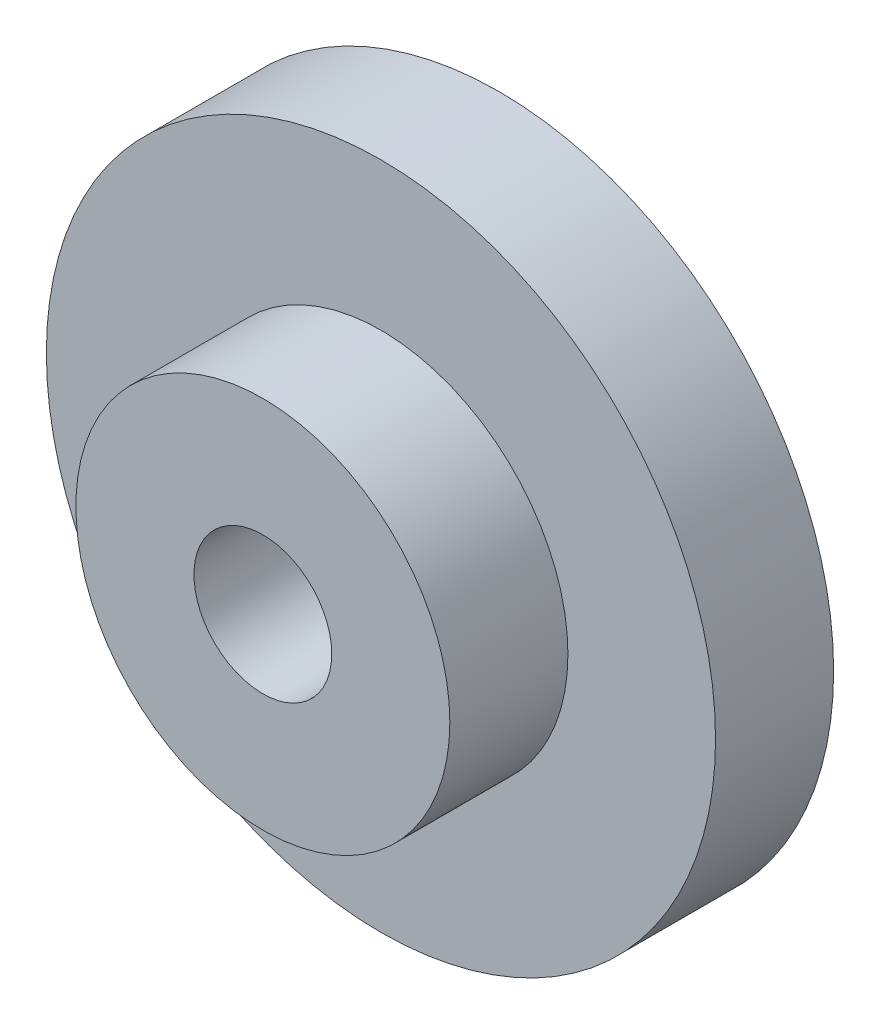
ISO-10303-21;
HEADER;
FILE_DESCRIPTION(('STEP AP214'),'2;1');
FILE_NAME('part.step','',(''),(''),'','','');
FILE_SCHEMA(('AUTOMOTIVE_DESIGN { 1 0 10303 214 1 1 1 1 }'));
ENDSEC;
DATA;
#1=APPLICATION_CONTEXT('core data for automotive mechanical design processes');
#2=APPLICATION_PROTOCOL_DEFINITION('international standard','automotive_design',2000,#1);
#3=PRODUCT_CONTEXT('',#1,'mechanical');
#4=PRODUCT('Part','Part','',(#3));
#5=PRODUCT_RELATED_PRODUCT_CATEGORY('part','',(#4));
#6=PRODUCT_DEFINITION_FORMATION('','',#4);
#7=PRODUCT_DEFINITION_CONTEXT('part definition',#1,'design');
#8=PRODUCT_DEFINITION('design','',#6,#7);
#9=PRODUCT_DEFINITION_SHAPE('','',#8);
#10=(LENGTH_UNIT() NAMED_UNIT(*) SI_UNIT(.MILLI.,.METRE.));
#11=(NAMED_UNIT(*) PLANE_ANGLE_UNIT() SI_UNIT($,.RADIAN.));
#12=(NAMED_UNIT(*) SI_UNIT($,.STERADIAN.) SOLID_ANGLE_UNIT());
#13=UNCERTAINTY_MEASURE_WITH_UNIT(LENGTH_MEASURE(1.E-05),#10,'distance_accuracy_value','');
#14=(GEOMETRIC_REPRESENTATION_CONTEXT(3) GLOBAL_UNCERTAINTY_ASSIGNED_CONTEXT((#13)) GLOBAL_UNIT_ASSIGNED_CONTEXT((#10,
#11,#12)) REPRESENTATION_CONTEXT('',''));
#15=CARTESIAN_POINT('',(0.,0.,0.));
#16=DIRECTION('',(0.,0.,1.));
#17=DIRECTION('',(1.,0.,0.));
#18=AXIS2_PLACEMENT_3D('',#15,#16,#17);
#19=CARTESIAN_POINT('',(0.,3.,3.35483870967742));
#20=DIRECTION('',(0.,0.,-1.));
#21=DIRECTION('',(-1.,0.,0.));
#22=AXIS2_PLACEMENT_3D('',#19,#20,#21);
#23=PLANE('',#22);
#24=CARTESIAN_POINT('',(0.,-1.75,3.35483870967742));
#25=DIRECTION('',(0.,0.,1.));
#26=DIRECTION('',(1.,0.,0.));
#27=AXIS2_PLACEMENT_3D('',#24,#25,#26);
#28=CIRCLE('',#27,1.75);
#29=CARTESIAN_POINT('',(1.75,-1.75,3.35483870967742));
#30=VERTEX_POINT('',#29);
#31=EDGE_CURVE('E10',#30,#30,#28,.T.);
#32=ORIENTED_EDGE('',*,*,#31,.F.);
#33=EDGE_LOOP('',(#32));
#34=FACE_BOUND('',#33,.T.);
#35=CARTESIAN_POINT('',(0.,-1.75,3.35483870967742));
#36=DIRECTION('',(0.,0.,1.));
#37=DIRECTION('',(1.,0.,0.));
#38=AXIS2_PLACEMENT_3D('',#35,#36,#37);
#39=CIRCLE('',#38,4.75);
#40=CARTESIAN_POINT('',(4.75,-1.75,3.35483870967742));
#41=VERTEX_POINT('',#40);
#42=EDGE_CURVE('E70',#41,#41,#39,.T.);
#43=ORIENTED_EDGE('',*,*,#42,.T.);
#44=EDGE_LOOP('',(#43));
#45=FACE_BOUND('',#44,.T.);
#46=ADVANCED_FACE('F43',(#34,#45),#23,.F.);
#47=CARTESIAN_POINT('',(0.,-1.75,3.35483870967742));
#48=DIRECTION('',(0.,0.,1.));
#49=DIRECTION('',(1.,0.,0.));
#50=AXIS2_PLACEMENT_3D('',#47,#48,#49);
#51=CYLINDRICAL_SURFACE('',#50,1.75);
#52=CARTESIAN_POINT('',(0.,-1.75,-2.64516129032258));
#53=DIRECTION('',(0.,0.,1.));
#54=DIRECTION('',(1.,0.,0.));
#55=AXIS2_PLACEMENT_3D('',#52,#53,#54);
#56=CIRCLE('',#55,1.75);
#57=CARTESIAN_POINT('',(1.75,-1.75,-2.64516129032258));
#58=VERTEX_POINT('',#57);
#59=EDGE_CURVE('E50',#58,#58,#56,.T.);
#60=ORIENTED_EDGE('',*,*,#59,.F.);
#61=EDGE_LOOP('',(#60));
#62=FACE_BOUND('',#61,.T.);
#63=ORIENTED_EDGE('',*,*,#31,.T.);
#64=EDGE_LOOP('',(#63));
#65=FACE_BOUND('',#64,.T.);
#66=ADVANCED_FACE('F96',(#62,#65),#51,.F.);
#67=CARTESIAN_POINT('',(0.,0.,-2.64516129032258));
#68=DIRECTION('',(0.,0.,1.));
#69=DIRECTION('',(1.,0.,0.));
#70=AXIS2_PLACEMENT_3D('',#67,#68,#69);
#71=PLANE('',#70);
#72=CARTESIAN_POINT('',(0.,-1.75,-2.64516129032258));
#73=DIRECTION('',(0.,0.,1.));
#74=DIRECTION('',(1.,0.,0.));
#75=AXIS2_PLACEMENT_3D('',#72,#73,#74);
#76=CIRCLE('',#75,8.5);
#77=CARTESIAN_POINT('',(8.5,-1.75,-2.64516129032258));
#78=VERTEX_POINT('',#77);
#79=EDGE_CURVE('E55',#78,#78,#76,.T.);
#80=ORIENTED_EDGE('',*,*,#79,.F.);
#81=EDGE_LOOP('',(#80));
#82=FACE_BOUND('',#81,.T.);
#83=ORIENTED_EDGE('',*,*,#59,.T.);
#84=EDGE_LOOP('',(#83));
#85=FACE_BOUND('',#84,.T.);
#86=ADVANCED_FACE('F91',(#82,#85),#71,.F.);
#87=CARTESIAN_POINT('',(0.,-1.75,3.35483870967742));
#88=DIRECTION('',(0.,0.,1.));
#89=DIRECTION('',(1.,0.,0.));
#90=AXIS2_PLACEMENT_3D('',#87,#88,#89);
#91=CYLINDRICAL_SURFACE('',#90,8.5);
#92=CARTESIAN_POINT('',(0.,-1.75,0.354838709677418));
#93=DIRECTION('',(0.,0.,1.));
#94=DIRECTION('',(1.,0.,0.));
#95=AXIS2_PLACEMENT_3D('',#92,#93,#94);
#96=CIRCLE('',#95,8.5);
#97=CARTESIAN_POINT('',(8.5,-1.75,0.354838709677418));
#98=VERTEX_POINT('',#97);
#99=EDGE_CURVE('E60',#98,#98,#96,.T.);
#100=ORIENTED_EDGE('',*,*,#99,.F.);
#101=EDGE_LOOP('',(#100));
#102=FACE_BOUND('',#101,.T.);
#103=ORIENTED_EDGE('',*,*,#79,.T.);
#104=EDGE_LOOP('',(#103));
#105=FACE_BOUND('',#104,.T.);
#106=ADVANCED_FACE('F85',(#102,#105),#91,.T.);
#107=CARTESIAN_POINT('',(0.,6.75,0.354838709677417));
#108=DIRECTION('',(0.,0.,-1.));
#109=DIRECTION('',(-1.,0.,0.));
#110=AXIS2_PLACEMENT_3D('',#107,#108,#109);
#111=PLANE('',#110);
#112=CARTESIAN_POINT('',(0.,-1.75,0.354838709677417));
#113=DIRECTION('',(0.,0.,1.));
#114=DIRECTION('',(1.,0.,0.));
#115=AXIS2_PLACEMENT_3D('',#112,#113,#114);
#116=CIRCLE('',#115,4.75);
#117=CARTESIAN_POINT('',(4.75,-1.75,0.354838709677417));
#118=VERTEX_POINT('',#117);
#119=EDGE_CURVE('E66',#118,#118,#116,.T.);
#120=ORIENTED_EDGE('',*,*,#119,.F.);
#121=EDGE_LOOP('',(#120));
#122=FACE_BOUND('',#121,.T.);
#123=ORIENTED_EDGE('',*,*,#99,.T.);
#124=EDGE_LOOP('',(#123));
#125=FACE_BOUND('',#124,.T.);
#126=ADVANCED_FACE('F79',(#122,#125),#111,.F.);
#127=CARTESIAN_POINT('',(0.,-1.75,3.35483870967742));
#128=DIRECTION('',(0.,0.,1.));
#129=DIRECTION('',(1.,0.,0.));
#130=AXIS2_PLACEMENT_3D('',#127,#128,#129);
#131=CYLINDRICAL_SURFACE('',#130,4.75);
#132=ORIENTED_EDGE('',*,*,#42,.F.);
#133=EDGE_LOOP('',(#132));
#134=FACE_BOUND('',#133,.T.);
#135=ORIENTED_EDGE('',*,*,#119,.T.);
#136=EDGE_LOOP('',(#135));
#137=FACE_BOUND('',#136,.T.);
#138=ADVANCED_FACE('F76',(#134,#137),#131,.T.);
#139=CLOSED_SHELL('',(#46,#66,#86,#106,#126,#138));
#140=MANIFOLD_SOLID_BREP('B2',#139);
#141=ADVANCED_BREP_SHAPE_REPRESENTATION('',(#18,#140),#14);
#142=SHAPE_DEFINITION_REPRESENTATION(#9,#141);
ENDSEC;
END-ISO-10303-21;
